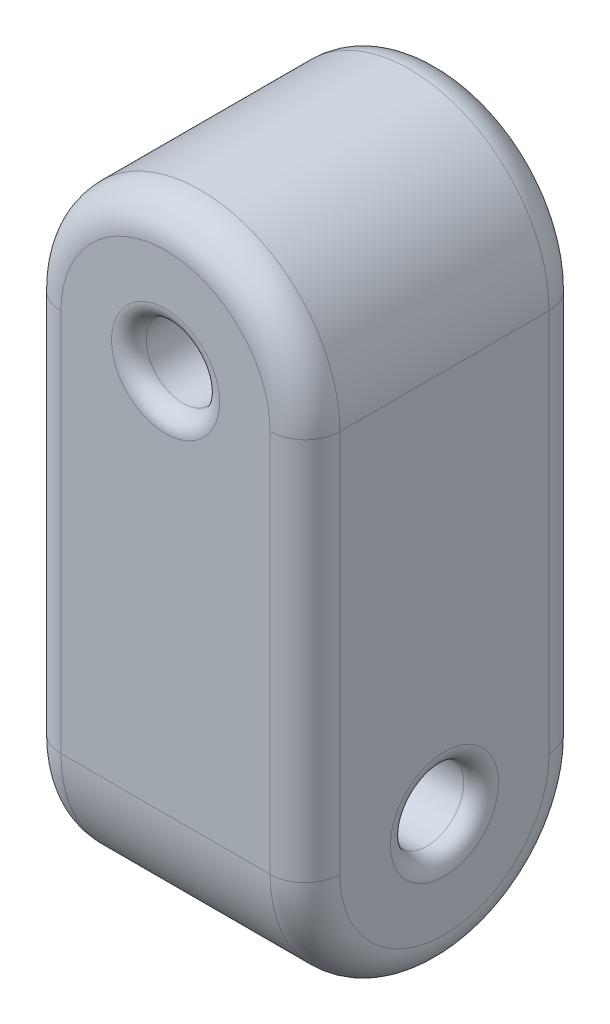
ISO-10303-21;
HEADER;
FILE_DESCRIPTION(('STEP AP214'),'2;1');
FILE_NAME('part.step','',(''),(''),'','','');
FILE_SCHEMA(('AUTOMOTIVE_DESIGN { 1 0 10303 214 1 1 1 1 }'));
ENDSEC;
DATA;
#1=APPLICATION_CONTEXT('core data for automotive mechanical design processes');
#2=APPLICATION_PROTOCOL_DEFINITION('international standard','automotive_design',2000,#1);
#3=PRODUCT_CONTEXT('',#1,'mechanical');
#4=PRODUCT('Part','Part','',(#3));
#5=PRODUCT_RELATED_PRODUCT_CATEGORY('part','',(#4));
#6=PRODUCT_DEFINITION_FORMATION('','',#4);
#7=PRODUCT_DEFINITION_CONTEXT('part definition',#1,'design');
#8=PRODUCT_DEFINITION('design','',#6,#7);
#9=PRODUCT_DEFINITION_SHAPE('','',#8);
#10=(LENGTH_UNIT() NAMED_UNIT(*) SI_UNIT(.MILLI.,.METRE.));
#11=(NAMED_UNIT(*) PLANE_ANGLE_UNIT() SI_UNIT($,.RADIAN.));
#12=(NAMED_UNIT(*) SI_UNIT($,.STERADIAN.) SOLID_ANGLE_UNIT());
#13=UNCERTAINTY_MEASURE_WITH_UNIT(LENGTH_MEASURE(1.E-05),#10,'distance_accuracy_value','');
#14=(GEOMETRIC_REPRESENTATION_CONTEXT(3) GLOBAL_UNCERTAINTY_ASSIGNED_CONTEXT((#13)) GLOBAL_UNIT_ASSIGNED_CONTEXT((#10,
#11,#12)) REPRESENTATION_CONTEXT('',''));
#15=CARTESIAN_POINT('',(0.,0.,0.));
#16=DIRECTION('',(0.,0.,1.));
#17=DIRECTION('',(1.,0.,0.));
#18=AXIS2_PLACEMENT_3D('',#15,#16,#17);
#19=CARTESIAN_POINT('',(0.,0.,8.8));
#20=DIRECTION('',(0.,0.,-1.));
#21=DIRECTION('',(-1.,0.,0.));
#22=AXIS2_PLACEMENT_3D('',#19,#20,#21);
#23=CYLINDRICAL_SURFACE('',#22,4.);
#24=DIRECTION('',(0.,0.,-1.));
#25=VECTOR('',#24,1.);
#26=CARTESIAN_POINT('',(-4.,0.,8.8));
#27=LINE('',#26,#25);
#28=CARTESIAN_POINT('',(-4.,0.,7.8));
#29=VERTEX_POINT('',#28);
#30=CARTESIAN_POINT('',(-4.,0.,1.8));
#31=VERTEX_POINT('',#30);
#32=EDGE_CURVE('E147',#29,#31,#27,.T.);
#33=ORIENTED_EDGE('',*,*,#32,.F.);
#34=CARTESIAN_POINT('',(0.,0.,7.8));
#35=DIRECTION('',(0.,0.,1.));
#36=DIRECTION('',(1.,0.,0.));
#37=AXIS2_PLACEMENT_3D('',#34,#35,#36);
#38=CIRCLE('',#37,4.);
#39=CARTESIAN_POINT('',(4.,0.,7.8));
#40=VERTEX_POINT('',#39);
#41=EDGE_CURVE('E167',#29,#40,#38,.F.);
#42=ORIENTED_EDGE('',*,*,#41,.T.);
#43=DIRECTION('',(0.,0.,-1.));
#44=VECTOR('',#43,1.);
#45=CARTESIAN_POINT('',(4.,0.,8.8));
#46=LINE('',#45,#44);
#47=CARTESIAN_POINT('',(4.,0.,1.8));
#48=VERTEX_POINT('',#47);
#49=EDGE_CURVE('E139',#40,#48,#46,.T.);
#50=ORIENTED_EDGE('',*,*,#49,.T.);
#51=CARTESIAN_POINT('',(0.,0.,1.8));
#52=DIRECTION('',(0.,0.,1.));
#53=DIRECTION('',(1.,0.,0.));
#54=AXIS2_PLACEMENT_3D('',#51,#52,#53);
#55=CIRCLE('',#54,4.);
#56=EDGE_CURVE('E165',#48,#31,#55,.T.);
#57=ORIENTED_EDGE('',*,*,#56,.T.);
#58=EDGE_LOOP('',(#33,#42,#50,#57));
#59=FACE_BOUND('',#58,.T.);
#60=ADVANCED_FACE('F35',(#59),#23,.T.);
#61=CARTESIAN_POINT('',(0.,0.,8.8));
#62=DIRECTION('',(0.,0.,1.));
#63=DIRECTION('',(1.,0.,0.));
#64=AXIS2_PLACEMENT_3D('',#61,#62,#63);
#65=PLANE('',#64);
#66=CARTESIAN_POINT('',(0.,0.,8.8));
#67=DIRECTION('',(0.,0.,1.));
#68=DIRECTION('',(1.,0.,0.));
#69=AXIS2_PLACEMENT_3D('',#66,#67,#68);
#70=CIRCLE('',#69,1.55);
#71=CARTESIAN_POINT('',(1.55,0.,8.8));
#72=VERTEX_POINT('',#71);
#73=EDGE_CURVE('E194',#72,#72,#70,.F.);
#74=ORIENTED_EDGE('',*,*,#73,.T.);
#75=EDGE_LOOP('',(#74));
#76=FACE_BOUND('',#75,.T.);
#77=DIRECTION('',(-1.,0.,0.));
#78=VECTOR('',#77,1.);
#79=CARTESIAN_POINT('',(4.,-11.,8.8));
#80=LINE('',#79,#78);
#81=CARTESIAN_POINT('',(3.,-11.,8.8));
#82=VERTEX_POINT('',#81);
#83=CARTESIAN_POINT('',(-3.,-11.,8.8));
#84=VERTEX_POINT('',#83);
#85=EDGE_CURVE('E136',#82,#84,#80,.T.);
#86=ORIENTED_EDGE('',*,*,#85,.F.);
#87=DIRECTION('',(0.,-1.,0.));
#88=VECTOR('',#87,1.);
#89=CARTESIAN_POINT('',(3.,0.,8.8));
#90=LINE('',#89,#88);
#91=CARTESIAN_POINT('',(3.,0.,8.8));
#92=VERTEX_POINT('',#91);
#93=EDGE_CURVE('E159',#82,#92,#90,.F.);
#94=ORIENTED_EDGE('',*,*,#93,.T.);
#95=CARTESIAN_POINT('',(0.,0.,8.8));
#96=DIRECTION('',(0.,0.,1.));
#97=DIRECTION('',(1.,0.,0.));
#98=AXIS2_PLACEMENT_3D('',#95,#96,#97);
#99=CIRCLE('',#98,3.);
#100=CARTESIAN_POINT('',(-3.,0.,8.8));
#101=VERTEX_POINT('',#100);
#102=EDGE_CURVE('E120',#92,#101,#99,.T.);
#103=ORIENTED_EDGE('',*,*,#102,.T.);
#104=DIRECTION('',(0.,-1.,0.));
#105=VECTOR('',#104,1.);
#106=CARTESIAN_POINT('',(-3.,-11.,8.8));
#107=LINE('',#106,#105);
#108=EDGE_CURVE('E157',#101,#84,#107,.T.);
#109=ORIENTED_EDGE('',*,*,#108,.T.);
#110=EDGE_LOOP('',(#86,#94,#103,#109));
#111=FACE_BOUND('',#110,.T.);
#112=ADVANCED_FACE('F211',(#76,#111),#65,.T.);
#113=CARTESIAN_POINT('',(0.,0.,0.8));
#114=DIRECTION('',(0.,0.,1.));
#115=DIRECTION('',(1.,0.,0.));
#116=AXIS2_PLACEMENT_3D('',#113,#114,#115);
#117=PLANE('',#116);
#118=CARTESIAN_POINT('',(0.,0.,0.8));
#119=DIRECTION('',(0.,0.,1.));
#120=DIRECTION('',(1.,0.,0.));
#121=AXIS2_PLACEMENT_3D('',#118,#119,#120);
#122=CIRCLE('',#121,1.55);
#123=CARTESIAN_POINT('',(1.55,0.,0.8));
#124=VERTEX_POINT('',#123);
#125=EDGE_CURVE('E11',#124,#124,#122,.T.);
#126=ORIENTED_EDGE('',*,*,#125,.T.);
#127=EDGE_LOOP('',(#126));
#128=FACE_BOUND('',#127,.T.);
#129=CARTESIAN_POINT('',(0.,0.,0.8));
#130=DIRECTION('',(0.,0.,1.));
#131=DIRECTION('',(1.,0.,0.));
#132=AXIS2_PLACEMENT_3D('',#129,#130,#131);
#133=CIRCLE('',#132,3.);
#134=CARTESIAN_POINT('',(-3.,0.,0.8));
#135=VERTEX_POINT('',#134);
#136=CARTESIAN_POINT('',(3.,0.,0.8));
#137=VERTEX_POINT('',#136);
#138=EDGE_CURVE('E129',#135,#137,#133,.F.);
#139=ORIENTED_EDGE('',*,*,#138,.T.);
#140=DIRECTION('',(0.,-1.,0.));
#141=VECTOR('',#140,1.);
#142=CARTESIAN_POINT('',(3.,-11.,0.8));
#143=LINE('',#142,#141);
#144=CARTESIAN_POINT('',(3.,-11.,0.8));
#145=VERTEX_POINT('',#144);
#146=EDGE_CURVE('E104',#137,#145,#143,.T.);
#147=ORIENTED_EDGE('',*,*,#146,.T.);
#148=DIRECTION('',(-1.,0.,0.));
#149=VECTOR('',#148,1.);
#150=CARTESIAN_POINT('',(4.,-11.,0.8));
#151=LINE('',#150,#149);
#152=CARTESIAN_POINT('',(-3.,-11.,0.8));
#153=VERTEX_POINT('',#152);
#154=EDGE_CURVE('E126',#145,#153,#151,.T.);
#155=ORIENTED_EDGE('',*,*,#154,.T.);
#156=DIRECTION('',(0.,-1.,0.));
#157=VECTOR('',#156,1.);
#158=CARTESIAN_POINT('',(-3.,0.,0.8));
#159=LINE('',#158,#157);
#160=EDGE_CURVE('E132',#153,#135,#159,.F.);
#161=ORIENTED_EDGE('',*,*,#160,.T.);
#162=EDGE_LOOP('',(#139,#147,#155,#161));
#163=FACE_BOUND('',#162,.T.);
#164=ADVANCED_FACE('F125',(#128,#163),#117,.F.);
#165=CARTESIAN_POINT('',(-4.,0.,8.8));
#166=DIRECTION('',(1.,0.,0.));
#167=DIRECTION('',(0.,1.,0.));
#168=AXIS2_PLACEMENT_3D('',#165,#166,#167);
#169=PLANE('',#168);
#170=CARTESIAN_POINT('',(-4.,-11.,4.8));
#171=DIRECTION('',(1.,0.,0.));
#172=DIRECTION('',(0.,1.,0.));
#173=AXIS2_PLACEMENT_3D('',#170,#171,#172);
#174=CIRCLE('',#173,1.55);
#175=CARTESIAN_POINT('',(-4.,-9.45,4.8));
#176=VERTEX_POINT('',#175);
#177=EDGE_CURVE('E168',#176,#176,#174,.T.);
#178=ORIENTED_EDGE('',*,*,#177,.T.);
#179=EDGE_LOOP('',(#178));
#180=FACE_BOUND('',#179,.T.);
#181=CARTESIAN_POINT('',(-4.,-11.,4.8));
#182=DIRECTION('',(1.,0.,0.));
#183=DIRECTION('',(0.,1.,0.));
#184=AXIS2_PLACEMENT_3D('',#181,#182,#183);
#185=CIRCLE('',#184,3.);
#186=CARTESIAN_POINT('',(-4.,-11.,1.8));
#187=VERTEX_POINT('',#186);
#188=CARTESIAN_POINT('',(-4.,-11.,7.8));
#189=VERTEX_POINT('',#188);
#190=EDGE_CURVE('E50',#187,#189,#185,.F.);
#191=ORIENTED_EDGE('',*,*,#190,.T.);
#192=DIRECTION('',(0.,-1.,0.));
#193=VECTOR('',#192,1.);
#194=CARTESIAN_POINT('',(-4.,0.,7.8));
#195=LINE('',#194,#193);
#196=EDGE_CURVE('E163',#189,#29,#195,.F.);
#197=ORIENTED_EDGE('',*,*,#196,.T.);
#198=ORIENTED_EDGE('',*,*,#32,.T.);
#199=DIRECTION('',(0.,-1.,0.));
#200=VECTOR('',#199,1.);
#201=CARTESIAN_POINT('',(-4.,0.,1.8));
#202=LINE('',#201,#200);
#203=EDGE_CURVE('E55',#31,#187,#202,.T.);
#204=ORIENTED_EDGE('',*,*,#203,.T.);
#205=EDGE_LOOP('',(#191,#197,#198,#204));
#206=FACE_BOUND('',#205,.T.);
#207=ADVANCED_FACE('F243',(#180,#206),#169,.F.);
#208=CARTESIAN_POINT('',(4.,0.,8.8));
#209=DIRECTION('',(1.,0.,0.));
#210=DIRECTION('',(0.,1.,0.));
#211=AXIS2_PLACEMENT_3D('',#208,#209,#210);
#212=PLANE('',#211);
#213=CARTESIAN_POINT('',(4.,-11.,4.8));
#214=DIRECTION('',(1.,0.,0.));
#215=DIRECTION('',(0.,1.,0.));
#216=AXIS2_PLACEMENT_3D('',#213,#214,#215);
#217=CIRCLE('',#216,1.55);
#218=CARTESIAN_POINT('',(4.,-9.45,4.8));
#219=VERTEX_POINT('',#218);
#220=EDGE_CURVE('E191',#219,#219,#217,.F.);
#221=ORIENTED_EDGE('',*,*,#220,.T.);
#222=EDGE_LOOP('',(#221));
#223=FACE_BOUND('',#222,.T.);
#224=CARTESIAN_POINT('',(4.,-11.,4.8));
#225=DIRECTION('',(1.,0.,0.));
#226=DIRECTION('',(0.,1.,0.));
#227=AXIS2_PLACEMENT_3D('',#224,#225,#226);
#228=CIRCLE('',#227,3.);
#229=CARTESIAN_POINT('',(4.,-11.,7.8));
#230=VERTEX_POINT('',#229);
#231=CARTESIAN_POINT('',(4.,-11.,1.8));
#232=VERTEX_POINT('',#231);
#233=EDGE_CURVE('E152',#230,#232,#228,.T.);
#234=ORIENTED_EDGE('',*,*,#233,.T.);
#235=DIRECTION('',(0.,-1.,0.));
#236=VECTOR('',#235,1.);
#237=CARTESIAN_POINT('',(4.,0.,1.8));
#238=LINE('',#237,#236);
#239=EDGE_CURVE('E106',#232,#48,#238,.F.);
#240=ORIENTED_EDGE('',*,*,#239,.T.);
#241=ORIENTED_EDGE('',*,*,#49,.F.);
#242=DIRECTION('',(0.,-1.,0.));
#243=VECTOR('',#242,1.);
#244=CARTESIAN_POINT('',(4.,0.,7.8));
#245=LINE('',#244,#243);
#246=EDGE_CURVE('E131',#40,#230,#245,.T.);
#247=ORIENTED_EDGE('',*,*,#246,.T.);
#248=EDGE_LOOP('',(#234,#240,#241,#247));
#249=FACE_BOUND('',#248,.T.);
#250=ADVANCED_FACE('F242',(#223,#249),#212,.T.);
#251=CARTESIAN_POINT('',(-4.,-11.,4.8));
#252=DIRECTION('',(1.,0.,0.));
#253=DIRECTION('',(0.,0.,-1.));
#254=AXIS2_PLACEMENT_3D('',#251,#252,#253);
#255=CYLINDRICAL_SURFACE('',#254,4.);
#256=ORIENTED_EDGE('',*,*,#154,.F.);
#257=CARTESIAN_POINT('',(3.,-11.,4.8));
#258=DIRECTION('',(1.,0.,0.));
#259=DIRECTION('',(0.,1.,0.));
#260=AXIS2_PLACEMENT_3D('',#257,#258,#259);
#261=CIRCLE('',#260,4.);
#262=EDGE_CURVE('E112',#145,#82,#261,.F.);
#263=ORIENTED_EDGE('',*,*,#262,.T.);
#264=ORIENTED_EDGE('',*,*,#85,.T.);
#265=CARTESIAN_POINT('',(-3.,-11.,4.8));
#266=DIRECTION('',(1.,0.,0.));
#267=DIRECTION('',(0.,1.,0.));
#268=AXIS2_PLACEMENT_3D('',#265,#266,#267);
#269=CIRCLE('',#268,4.);
#270=EDGE_CURVE('E121',#84,#153,#269,.T.);
#271=ORIENTED_EDGE('',*,*,#270,.T.);
#272=EDGE_LOOP('',(#256,#263,#264,#271));
#273=FACE_BOUND('',#272,.T.);
#274=ADVANCED_FACE('F134',(#273),#255,.T.);
#275=CARTESIAN_POINT('',(0.,0.,9.6));
#276=DIRECTION('',(0.,0.,-1.));
#277=DIRECTION('',(-1.,0.,0.));
#278=AXIS2_PLACEMENT_3D('',#275,#276,#277);
#279=CYLINDRICAL_SURFACE('',#278,1.05);
#280=CARTESIAN_POINT('',(0.,0.,8.3));
#281=DIRECTION('',(0.,0.,1.));
#282=DIRECTION('',(1.,0.,0.));
#283=AXIS2_PLACEMENT_3D('',#280,#281,#282);
#284=CIRCLE('',#283,1.05);
#285=CARTESIAN_POINT('',(1.05,0.,8.3));
#286=VERTEX_POINT('',#285);
#287=EDGE_CURVE('E43',#286,#286,#284,.T.);
#288=ORIENTED_EDGE('',*,*,#287,.T.);
#289=EDGE_LOOP('',(#288));
#290=FACE_BOUND('',#289,.T.);
#291=CARTESIAN_POINT('',(0.,0.,1.3));
#292=DIRECTION('',(0.,0.,1.));
#293=DIRECTION('',(1.,0.,0.));
#294=AXIS2_PLACEMENT_3D('',#291,#292,#293);
#295=CIRCLE('',#294,1.05);
#296=CARTESIAN_POINT('',(1.05,0.,1.3));
#297=VERTEX_POINT('',#296);
#298=EDGE_CURVE('E197',#297,#297,#295,.F.);
#299=ORIENTED_EDGE('',*,*,#298,.T.);
#300=EDGE_LOOP('',(#299));
#301=FACE_BOUND('',#300,.T.);
#302=ADVANCED_FACE('F202',(#290,#301),#279,.F.);
#303=CARTESIAN_POINT('',(-4.975,-11.,4.8));
#304=DIRECTION('',(1.,0.,0.));
#305=DIRECTION('',(0.,0.,-1.));
#306=AXIS2_PLACEMENT_3D('',#303,#304,#305);
#307=CYLINDRICAL_SURFACE('',#306,1.05);
#308=CARTESIAN_POINT('',(-3.5,-11.,4.8));
#309=DIRECTION('',(1.,0.,0.));
#310=DIRECTION('',(0.,1.,0.));
#311=AXIS2_PLACEMENT_3D('',#308,#309,#310);
#312=CIRCLE('',#311,1.05);
#313=CARTESIAN_POINT('',(-3.5,-11.,3.75));
#314=VERTEX_POINT('',#313);
#315=EDGE_CURVE('E188',#314,#314,#312,.F.);
#316=CARTESIAN_POINT('',(3.5,-11.,4.8));
#317=DIRECTION('',(1.,0.,0.));
#318=DIRECTION('',(0.,1.,0.));
#319=AXIS2_PLACEMENT_3D('',#316,#317,#318);
#320=CIRCLE('',#319,1.05);
#321=CARTESIAN_POINT('',(3.5,-11.,3.75));
#322=VERTEX_POINT('',#321);
#323=EDGE_CURVE('E185',#322,#322,#320,.T.);
#324=CARTESIAN_POINT('',(-3.5,-11.,3.75));
#325=CARTESIAN_POINT('',(-3.42708333333333,-11.,3.75));
#326=CARTESIAN_POINT('',(-3.35416666666666,-11.,3.75));
#327=CARTESIAN_POINT('',(-3.20833333333333,-11.,3.75));
#328=CARTESIAN_POINT('',(-3.13541666666666,-11.,3.75));
#329=CARTESIAN_POINT('',(-2.98958333333333,-11.,3.75));
#330=CARTESIAN_POINT('',(-2.91666666666666,-11.,3.75));
#331=CARTESIAN_POINT('',(-2.77083333333333,-11.,3.75));
#332=CARTESIAN_POINT('',(-2.69791666666666,-11.,3.75));
#333=CARTESIAN_POINT('',(-2.55208333333333,-11.,3.75));
#334=CARTESIAN_POINT('',(-2.47916666666666,-11.,3.75));
#335=CARTESIAN_POINT('',(-2.33333333333333,-11.,3.75));
#336=CARTESIAN_POINT('',(-2.26041666666666,-11.,3.75));
#337=CARTESIAN_POINT('',(-2.11458333333333,-11.,3.75));
#338=CARTESIAN_POINT('',(-2.04166666666666,-11.,3.75));
#339=CARTESIAN_POINT('',(-1.89583333333333,-11.,3.75));
#340=CARTESIAN_POINT('',(-1.82291666666667,-11.,3.75));
#341=CARTESIAN_POINT('',(-1.67708333333333,-11.,3.75));
#342=CARTESIAN_POINT('',(-1.60416666666667,-11.,3.75));
#343=CARTESIAN_POINT('',(-1.45833333333333,-11.,3.75));
#344=CARTESIAN_POINT('',(-1.38541666666667,-11.,3.75));
#345=CARTESIAN_POINT('',(-1.23958333333333,-11.,3.75));
#346=CARTESIAN_POINT('',(-1.16666666666667,-11.,3.75));
#347=CARTESIAN_POINT('',(-1.02083333333333,-11.,3.75));
#348=CARTESIAN_POINT('',(-0.947916666666666,-11.,3.75));
#349=CARTESIAN_POINT('',(-0.802083333333333,-11.,3.75));
#350=CARTESIAN_POINT('',(-0.729166666666666,-11.,3.75));
#351=CARTESIAN_POINT('',(-0.583333333333333,-11.,3.75));
#352=CARTESIAN_POINT('',(-0.510416666666667,-11.,3.75));
#353=CARTESIAN_POINT('',(-0.364583333333334,-11.,3.75));
#354=CARTESIAN_POINT('',(-0.291666666666667,-11.,3.75));
#355=CARTESIAN_POINT('',(-0.145833333333333,-11.,3.75));
#356=CARTESIAN_POINT('',(-0.0729166666666667,-11.,3.75));
#357=CARTESIAN_POINT('',(0.0729166666666664,-11.,3.75));
#358=CARTESIAN_POINT('',(0.145833333333333,-11.,3.75));
#359=CARTESIAN_POINT('',(0.291666666666666,-11.,3.75));
#360=CARTESIAN_POINT('',(0.364583333333332,-11.,3.75));
#361=CARTESIAN_POINT('',(0.510416666666665,-11.,3.75));
#362=CARTESIAN_POINT('',(0.583333333333332,-11.,3.75));
#363=CARTESIAN_POINT('',(0.729166666666666,-11.,3.75));
#364=CARTESIAN_POINT('',(0.802083333333332,-11.,3.75));
#365=CARTESIAN_POINT('',(0.947916666666666,-11.,3.75));
#366=CARTESIAN_POINT('',(1.02083333333333,-11.,3.75));
#367=CARTESIAN_POINT('',(1.16666666666667,-11.,3.75));
#368=CARTESIAN_POINT('',(1.23958333333333,-11.,3.75));
#369=CARTESIAN_POINT('',(1.38541666666666,-11.,3.75));
#370=CARTESIAN_POINT('',(1.45833333333333,-11.,3.75));
#371=CARTESIAN_POINT('',(1.60416666666666,-11.,3.75));
#372=CARTESIAN_POINT('',(1.67708333333333,-11.,3.75));
#373=CARTESIAN_POINT('',(1.82291666666666,-11.,3.75));
#374=CARTESIAN_POINT('',(1.89583333333333,-11.,3.75));
#375=CARTESIAN_POINT('',(2.04166666666667,-11.,3.75));
#376=CARTESIAN_POINT('',(2.11458333333333,-11.,3.75));
#377=CARTESIAN_POINT('',(2.26041666666666,-11.,3.75));
#378=CARTESIAN_POINT('',(2.33333333333333,-11.,3.75));
#379=CARTESIAN_POINT('',(2.47916666666666,-11.,3.75));
#380=CARTESIAN_POINT('',(2.55208333333333,-11.,3.75));
#381=CARTESIAN_POINT('',(2.69791666666666,-11.,3.75));
#382=CARTESIAN_POINT('',(2.77083333333333,-11.,3.75));
#383=CARTESIAN_POINT('',(2.91666666666666,-11.,3.75));
#384=CARTESIAN_POINT('',(2.98958333333333,-11.,3.75));
#385=CARTESIAN_POINT('',(3.13541666666666,-11.,3.75));
#386=CARTESIAN_POINT('',(3.20833333333333,-11.,3.75));
#387=CARTESIAN_POINT('',(3.35416666666666,-11.,3.75));
#388=CARTESIAN_POINT('',(3.42708333333333,-11.,3.75));
#389=CARTESIAN_POINT('',(3.5,-11.,3.75));
#390=B_SPLINE_CURVE_WITH_KNOTS('',3,(#324,#325,#326,#327,#328,#329,#330,#331,#332,#333,#334,
#335,#336,#337,#338,#339,#340,#341,#342,#343,#344,#345,#346,#347,#348,#349,#350,#351,#352,#353,
#354,#355,#356,#357,#358,#359,#360,#361,#362,#363,#364,#365,#366,#367,#368,#369,#370,#371,#372,
#373,#374,#375,#376,#377,#378,#379,#380,#381,#382,#383,#384,#385,#386,#387,#388,#389),
.UNSPECIFIED.,.F.,.F.,(4,2,2,2,2,2,2,2,2,2,2,2,2,2,2,2,2,2,2,2,2,2,2,2,2,2,2,2,2,2,2,2,4),(0.,
0.21875,0.4375,0.656249999999999,0.874999999999999,1.09375,1.3125,1.53125,1.75,1.96875,2.1875,
2.40625,2.625,2.84375,3.0625,3.28125,3.5,3.71875,3.9375,4.15625,4.375,4.59375,4.81249999999999,
5.03124999999999,5.25,5.46875,5.6875,5.90624999999999,6.12499999999999,6.34374999999999,
6.56249999999999,6.78124999999999,6.99999999999999),.UNSPECIFIED.);
#391=EDGE_CURVE('BSEAM277',#314,#322,#390,.T.);
#392=ORIENTED_EDGE('',*,*,#315,.T.);
#393=ORIENTED_EDGE('',*,*,#323,.T.);
#394=ORIENTED_EDGE('',*,*,#391,.T.);
#395=ORIENTED_EDGE('',*,*,#391,.F.);
#396=EDGE_LOOP('',(#392,#394,#393,#395));
#397=FACE_BOUND('',#396,.T.);
#398=ADVANCED_FACE('F277',(#397),#307,.F.);
#399=CARTESIAN_POINT('',(-3.,0.,7.8));
#400=DIRECTION('',(0.,1.,0.));
#401=DIRECTION('',(-1.,0.,0.));
#402=AXIS2_PLACEMENT_3D('',#399,#400,#401);
#403=CYLINDRICAL_SURFACE('',#402,1.);
#404=CARTESIAN_POINT('',(-3.,0.,7.8));
#405=DIRECTION('',(0.,1.,0.));
#406=DIRECTION('',(-1.,0.,0.));
#407=AXIS2_PLACEMENT_3D('',#404,#405,#406);
#408=CIRCLE('',#407,1.);
#409=EDGE_CURVE('E142',#29,#101,#408,.T.);
#410=ORIENTED_EDGE('',*,*,#409,.F.);
#411=ORIENTED_EDGE('',*,*,#196,.F.);
#412=CARTESIAN_POINT('',(-3.,-11.,7.8));
#413=DIRECTION('',(0.,-1.,0.));
#414=DIRECTION('',(0.,0.,-1.));
#415=AXIS2_PLACEMENT_3D('',#412,#413,#414);
#416=CIRCLE('',#415,1.);
#417=EDGE_CURVE('E137',#84,#189,#416,.T.);
#418=ORIENTED_EDGE('',*,*,#417,.F.);
#419=ORIENTED_EDGE('',*,*,#108,.F.);
#420=EDGE_LOOP('',(#410,#411,#418,#419));
#421=FACE_BOUND('',#420,.T.);
#422=ADVANCED_FACE('F228',(#421),#403,.T.);
#423=CARTESIAN_POINT('',(-3.,-11.,4.8));
#424=DIRECTION('',(1.,0.,0.));
#425=DIRECTION('',(0.,1.,0.));
#426=AXIS2_PLACEMENT_3D('',#423,#424,#425);
#427=TOROIDAL_SURFACE('',#426,3.,1.);
#428=ORIENTED_EDGE('',*,*,#417,.T.);
#429=ORIENTED_EDGE('',*,*,#190,.F.);
#430=CARTESIAN_POINT('',(-3.,-11.,1.8));
#431=DIRECTION('',(0.,1.,0.));
#432=DIRECTION('',(0.,0.,1.));
#433=AXIS2_PLACEMENT_3D('',#430,#431,#432);
#434=CIRCLE('',#433,1.);
#435=EDGE_CURVE('E178',#153,#187,#434,.T.);
#436=ORIENTED_EDGE('',*,*,#435,.F.);
#437=ORIENTED_EDGE('',*,*,#270,.F.);
#438=EDGE_LOOP('',(#428,#429,#436,#437));
#439=FACE_BOUND('',#438,.T.);
#440=ADVANCED_FACE('F230',(#439),#427,.T.);
#441=CARTESIAN_POINT('',(0.,0.,7.8));
#442=DIRECTION('',(0.,0.,1.));
#443=DIRECTION('',(1.,0.,0.));
#444=AXIS2_PLACEMENT_3D('',#441,#442,#443);
#445=TOROIDAL_SURFACE('',#444,3.,1.);
#446=ORIENTED_EDGE('',*,*,#409,.T.);
#447=ORIENTED_EDGE('',*,*,#102,.F.);
#448=CARTESIAN_POINT('',(3.,0.,7.8));
#449=DIRECTION('',(0.,-1.,0.));
#450=DIRECTION('',(0.,0.,-1.));
#451=AXIS2_PLACEMENT_3D('',#448,#449,#450);
#452=CIRCLE('',#451,1.);
#453=EDGE_CURVE('E175',#40,#92,#452,.T.);
#454=ORIENTED_EDGE('',*,*,#453,.F.);
#455=ORIENTED_EDGE('',*,*,#41,.F.);
#456=EDGE_LOOP('',(#446,#447,#454,#455));
#457=FACE_BOUND('',#456,.T.);
#458=ADVANCED_FACE('F225',(#457),#445,.T.);
#459=CARTESIAN_POINT('',(-3.,0.,1.8));
#460=DIRECTION('',(0.,-1.,0.));
#461=DIRECTION('',(1.,0.,0.));
#462=AXIS2_PLACEMENT_3D('',#459,#460,#461);
#463=CYLINDRICAL_SURFACE('',#462,1.);
#464=ORIENTED_EDGE('',*,*,#435,.T.);
#465=ORIENTED_EDGE('',*,*,#203,.F.);
#466=CARTESIAN_POINT('',(-3.,0.,1.8));
#467=DIRECTION('',(0.,1.,0.));
#468=DIRECTION('',(-1.,0.,0.));
#469=AXIS2_PLACEMENT_3D('',#466,#467,#468);
#470=CIRCLE('',#469,1.);
#471=EDGE_CURVE('E172',#135,#31,#470,.T.);
#472=ORIENTED_EDGE('',*,*,#471,.F.);
#473=ORIENTED_EDGE('',*,*,#160,.F.);
#474=EDGE_LOOP('',(#464,#465,#472,#473));
#475=FACE_BOUND('',#474,.T.);
#476=ADVANCED_FACE('F234',(#475),#463,.T.);
#477=CARTESIAN_POINT('',(3.,0.,7.8));
#478=DIRECTION('',(0.,-1.,0.));
#479=DIRECTION('',(1.,0.,0.));
#480=AXIS2_PLACEMENT_3D('',#477,#478,#479);
#481=CYLINDRICAL_SURFACE('',#480,1.);
#482=ORIENTED_EDGE('',*,*,#453,.T.);
#483=ORIENTED_EDGE('',*,*,#93,.F.);
#484=CARTESIAN_POINT('',(3.,-11.,7.8));
#485=DIRECTION('',(0.,-1.,0.));
#486=DIRECTION('',(0.,0.,-1.));
#487=AXIS2_PLACEMENT_3D('',#484,#485,#486);
#488=CIRCLE('',#487,1.);
#489=EDGE_CURVE('E115',#230,#82,#488,.T.);
#490=ORIENTED_EDGE('',*,*,#489,.F.);
#491=ORIENTED_EDGE('',*,*,#246,.F.);
#492=EDGE_LOOP('',(#482,#483,#490,#491));
#493=FACE_BOUND('',#492,.T.);
#494=ADVANCED_FACE('F220',(#493),#481,.T.);
#495=CARTESIAN_POINT('',(0.,0.,1.8));
#496=DIRECTION('',(0.,0.,1.));
#497=DIRECTION('',(1.,0.,0.));
#498=AXIS2_PLACEMENT_3D('',#495,#496,#497);
#499=TOROIDAL_SURFACE('',#498,3.,1.);
#500=ORIENTED_EDGE('',*,*,#471,.T.);
#501=ORIENTED_EDGE('',*,*,#56,.F.);
#502=CARTESIAN_POINT('',(3.,0.,1.8));
#503=DIRECTION('',(0.,-1.,0.));
#504=DIRECTION('',(1.,0.,0.));
#505=AXIS2_PLACEMENT_3D('',#502,#503,#504);
#506=CIRCLE('',#505,1.);
#507=EDGE_CURVE('E109',#137,#48,#506,.T.);
#508=ORIENTED_EDGE('',*,*,#507,.F.);
#509=ORIENTED_EDGE('',*,*,#138,.F.);
#510=EDGE_LOOP('',(#500,#501,#508,#509));
#511=FACE_BOUND('',#510,.T.);
#512=ADVANCED_FACE('F237',(#511),#499,.T.);
#513=CARTESIAN_POINT('',(3.,-11.,4.8));
#514=DIRECTION('',(1.,0.,0.));
#515=DIRECTION('',(0.,1.,0.));
#516=AXIS2_PLACEMENT_3D('',#513,#514,#515);
#517=TOROIDAL_SURFACE('',#516,3.,1.);
#518=ORIENTED_EDGE('',*,*,#489,.T.);
#519=ORIENTED_EDGE('',*,*,#262,.F.);
#520=CARTESIAN_POINT('',(3.,-11.,1.8));
#521=DIRECTION('',(0.,1.,0.));
#522=DIRECTION('',(0.,0.,1.));
#523=AXIS2_PLACEMENT_3D('',#520,#521,#522);
#524=CIRCLE('',#523,1.);
#525=EDGE_CURVE('E100',#232,#145,#524,.T.);
#526=ORIENTED_EDGE('',*,*,#525,.F.);
#527=ORIENTED_EDGE('',*,*,#233,.F.);
#528=EDGE_LOOP('',(#518,#519,#526,#527));
#529=FACE_BOUND('',#528,.T.);
#530=ADVANCED_FACE('F113',(#529),#517,.T.);
#531=CARTESIAN_POINT('',(3.,0.,1.8));
#532=DIRECTION('',(0.,1.,0.));
#533=DIRECTION('',(-1.,0.,0.));
#534=AXIS2_PLACEMENT_3D('',#531,#532,#533);
#535=CYLINDRICAL_SURFACE('',#534,1.);
#536=ORIENTED_EDGE('',*,*,#507,.T.);
#537=ORIENTED_EDGE('',*,*,#239,.F.);
#538=ORIENTED_EDGE('',*,*,#525,.T.);
#539=ORIENTED_EDGE('',*,*,#146,.F.);
#540=EDGE_LOOP('',(#536,#537,#538,#539));
#541=FACE_BOUND('',#540,.T.);
#542=ADVANCED_FACE('F102',(#541),#535,.T.);
#543=CARTESIAN_POINT('',(-3.5,-11.,4.8));
#544=DIRECTION('',(1.,0.,0.));
#545=DIRECTION('',(0.,1.,0.));
#546=AXIS2_PLACEMENT_3D('',#543,#544,#545);
#547=TOROIDAL_SURFACE('',#546,1.55,0.5);
#548=ORIENTED_EDGE('',*,*,#315,.F.);
#549=EDGE_LOOP('',(#548));
#550=FACE_BOUND('',#549,.T.);
#551=ORIENTED_EDGE('',*,*,#177,.F.);
#552=EDGE_LOOP('',(#551));
#553=FACE_BOUND('',#552,.T.);
#554=ADVANCED_FACE('F262',(#550,#553),#547,.T.);
#555=CARTESIAN_POINT('',(3.5,-11.,4.8));
#556=DIRECTION('',(1.,0.,0.));
#557=DIRECTION('',(0.,1.,0.));
#558=AXIS2_PLACEMENT_3D('',#555,#556,#557);
#559=TOROIDAL_SURFACE('',#558,1.55,0.5);
#560=ORIENTED_EDGE('',*,*,#220,.F.);
#561=EDGE_LOOP('',(#560));
#562=FACE_BOUND('',#561,.T.);
#563=ORIENTED_EDGE('',*,*,#323,.F.);
#564=EDGE_LOOP('',(#563));
#565=FACE_BOUND('',#564,.T.);
#566=ADVANCED_FACE('F208',(#562,#565),#559,.T.);
#567=CARTESIAN_POINT('',(0.,0.,8.3));
#568=DIRECTION('',(0.,0.,1.));
#569=DIRECTION('',(1.,0.,0.));
#570=AXIS2_PLACEMENT_3D('',#567,#568,#569);
#571=TOROIDAL_SURFACE('',#570,1.55,0.5);
#572=ORIENTED_EDGE('',*,*,#287,.F.);
#573=EDGE_LOOP('',(#572));
#574=FACE_BOUND('',#573,.T.);
#575=ORIENTED_EDGE('',*,*,#73,.F.);
#576=EDGE_LOOP('',(#575));
#577=FACE_BOUND('',#576,.T.);
#578=ADVANCED_FACE('F205',(#574,#577),#571,.T.);
#579=CARTESIAN_POINT('',(0.,0.,1.3));
#580=DIRECTION('',(0.,0.,1.));
#581=DIRECTION('',(1.,0.,0.));
#582=AXIS2_PLACEMENT_3D('',#579,#580,#581);
#583=TOROIDAL_SURFACE('',#582,1.55,0.5);
#584=ORIENTED_EDGE('',*,*,#125,.F.);
#585=EDGE_LOOP('',(#584));
#586=FACE_BOUND('',#585,.T.);
#587=ORIENTED_EDGE('',*,*,#298,.F.);
#588=EDGE_LOOP('',(#587));
#589=FACE_BOUND('',#588,.T.);
#590=ADVANCED_FACE('F37',(#586,#589),#583,.T.);
#591=CLOSED_SHELL('',(#60,#112,#164,#207,#250,#274,#302,#398,#422,#440,#458,#476,#494,#512,#530,
#542,#554,#566,#578,#590));
#592=MANIFOLD_SOLID_BREP('B2',#591);
#593=ADVANCED_BREP_SHAPE_REPRESENTATION('',(#18,#592),#14);
#594=SHAPE_DEFINITION_REPRESENTATION(#9,#593);
ENDSEC;
END-ISO-10303-21;
